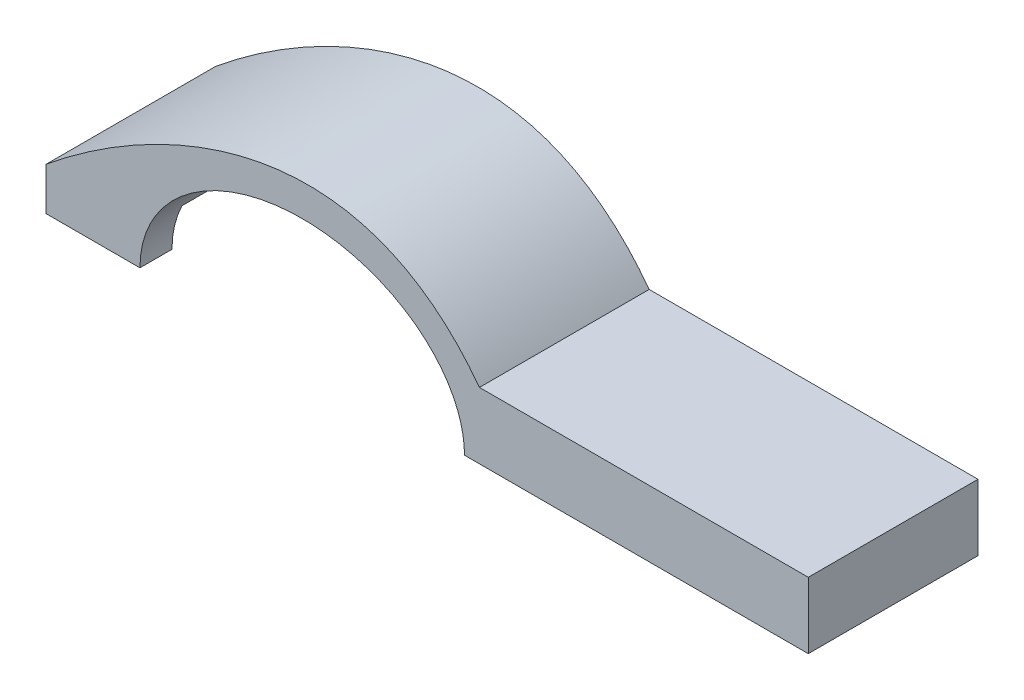
ISO-10303-21;
HEADER;
FILE_DESCRIPTION(('STEP AP214'),'2;1');
FILE_NAME('part.step','',(''),(''),'','','');
FILE_SCHEMA(('AUTOMOTIVE_DESIGN { 1 0 10303 214 1 1 1 1 }'));
ENDSEC;
DATA;
#1=APPLICATION_CONTEXT('core data for automotive mechanical design processes');
#2=APPLICATION_PROTOCOL_DEFINITION('international standard','automotive_design',2000,#1);
#3=PRODUCT_CONTEXT('',#1,'mechanical');
#4=PRODUCT('Part','Part','',(#3));
#5=PRODUCT_RELATED_PRODUCT_CATEGORY('part','',(#4));
#6=PRODUCT_DEFINITION_FORMATION('','',#4);
#7=PRODUCT_DEFINITION_CONTEXT('part definition',#1,'design');
#8=PRODUCT_DEFINITION('design','',#6,#7);
#9=PRODUCT_DEFINITION_SHAPE('','',#8);
#10=(LENGTH_UNIT() NAMED_UNIT(*) SI_UNIT(.MILLI.,.METRE.));
#11=(NAMED_UNIT(*) PLANE_ANGLE_UNIT() SI_UNIT($,.RADIAN.));
#12=(NAMED_UNIT(*) SI_UNIT($,.STERADIAN.) SOLID_ANGLE_UNIT());
#13=UNCERTAINTY_MEASURE_WITH_UNIT(LENGTH_MEASURE(1.E-05),#10,'distance_accuracy_value','');
#14=(GEOMETRIC_REPRESENTATION_CONTEXT(3) GLOBAL_UNCERTAINTY_ASSIGNED_CONTEXT((#13)) GLOBAL_UNIT_ASSIGNED_CONTEXT((#10,
#11,#12)) REPRESENTATION_CONTEXT('',''));
#15=CARTESIAN_POINT('',(0.,0.,0.));
#16=DIRECTION('',(0.,0.,1.));
#17=DIRECTION('',(1.,0.,0.));
#18=AXIS2_PLACEMENT_3D('',#15,#16,#17);
#19=CARTESIAN_POINT('',(15.3209477636629,-4.36351166737579,7.95));
#20=DIRECTION('',(1.,0.,0.));
#21=DIRECTION('',(0.,1.,0.));
#22=AXIS2_PLACEMENT_3D('',#19,#20,#21);
#23=PLANE('',#22);
#24=DIRECTION('',(0.,0.,-1.));
#25=VECTOR('',#24,1.);
#26=CARTESIAN_POINT('',(15.3209477636629,-4.36351166737579,7.95));
#27=LINE('',#26,#25);
#28=CARTESIAN_POINT('',(15.3209477636629,-4.36351166737579,1.5));
#29=VERTEX_POINT('',#28);
#30=CARTESIAN_POINT('',(15.3209477636629,-4.36351166737579,0.));
#31=VERTEX_POINT('',#30);
#32=EDGE_CURVE('E273',#29,#31,#27,.T.);
#33=ORIENTED_EDGE('',*,*,#32,.F.);
#34=DIRECTION('',(0.,-1.,0.));
#35=VECTOR('',#34,1.);
#36=CARTESIAN_POINT('',(15.3209477636629,-4.36351166737579,1.5));
#37=LINE('',#36,#35);
#38=CARTESIAN_POINT('',(15.3209477636629,-2.36351166737579,1.5));
#39=VERTEX_POINT('',#38);
#40=EDGE_CURVE('E182',#39,#29,#37,.T.);
#41=ORIENTED_EDGE('',*,*,#40,.F.);
#42=DIRECTION('',(0.,0.,-1.));
#43=VECTOR('',#42,1.);
#44=CARTESIAN_POINT('',(15.3209477636629,-2.36351166737579,7.95));
#45=LINE('',#44,#43);
#46=CARTESIAN_POINT('',(15.3209477636629,-2.36351166737579,0.));
#47=VERTEX_POINT('',#46);
#48=EDGE_CURVE('E249',#39,#47,#45,.T.);
#49=ORIENTED_EDGE('',*,*,#48,.T.);
#50=DIRECTION('',(0.,-1.,0.));
#51=VECTOR('',#50,1.);
#52=CARTESIAN_POINT('',(15.3209477636629,-4.36351166737579,0.));
#53=LINE('',#52,#51);
#54=EDGE_CURVE('E278',#47,#31,#53,.T.);
#55=ORIENTED_EDGE('',*,*,#54,.T.);
#56=EDGE_LOOP('',(#33,#41,#49,#55));
#57=FACE_BOUND('',#56,.T.);
#58=ADVANCED_FACE('F32',(#57),#23,.F.);
#59=CARTESIAN_POINT('',(19.7209477636629,-4.36351166737578,7.95));
#60=DIRECTION('',(0.,1.,0.));
#61=DIRECTION('',(-1.,0.,0.));
#62=AXIS2_PLACEMENT_3D('',#59,#60,#61);
#63=PLANE('',#62);
#64=DIRECTION('',(0.,0.,-1.));
#65=VECTOR('',#64,1.);
#66=CARTESIAN_POINT('',(19.7209477636629,-4.36351166737579,7.95));
#67=LINE('',#66,#65);
#68=CARTESIAN_POINT('',(19.7209477636629,-4.36351166737578,1.5));
#69=VERTEX_POINT('',#68);
#70=CARTESIAN_POINT('',(19.7209477636629,-4.36351166737579,0.));
#71=VERTEX_POINT('',#70);
#72=EDGE_CURVE('E275',#69,#71,#67,.T.);
#73=ORIENTED_EDGE('',*,*,#72,.F.);
#74=DIRECTION('',(-1.,0.,0.));
#75=VECTOR('',#74,1.);
#76=CARTESIAN_POINT('',(23.1209477636629,-4.36351166737578,1.5));
#77=LINE('',#76,#75);
#78=EDGE_CURVE('E185',#69,#29,#77,.T.);
#79=ORIENTED_EDGE('',*,*,#78,.T.);
#80=ORIENTED_EDGE('',*,*,#32,.T.);
#81=DIRECTION('',(1.,0.,0.));
#82=VECTOR('',#81,1.);
#83=CARTESIAN_POINT('',(19.7209477636629,-4.36351166737578,0.));
#84=LINE('',#83,#82);
#85=EDGE_CURVE('E294',#31,#71,#84,.T.);
#86=ORIENTED_EDGE('',*,*,#85,.T.);
#87=EDGE_LOOP('',(#73,#79,#80,#86));
#88=FACE_BOUND('',#87,.T.);
#89=ADVANCED_FACE('F222',(#88),#63,.F.);
#90=CARTESIAN_POINT('',(51.0209477636629,-4.36351166737578,7.95));
#91=DIRECTION('',(-1.,0.,0.));
#92=DIRECTION('',(0.,0.,1.));
#93=AXIS2_PLACEMENT_3D('',#90,#91,#92);
#94=PLANE('',#93);
#95=DIRECTION('',(0.,1.,0.));
#96=VECTOR('',#95,1.);
#97=CARTESIAN_POINT('',(51.0209477636629,-4.36351166737578,0.));
#98=LINE('',#97,#96);
#99=CARTESIAN_POINT('',(51.0209477636629,-4.36351166737578,0.));
#100=VERTEX_POINT('',#99);
#101=CARTESIAN_POINT('',(51.0209477636629,-1.26351166737578,0.));
#102=VERTEX_POINT('',#101);
#103=EDGE_CURVE('E188',#100,#102,#98,.T.);
#104=ORIENTED_EDGE('',*,*,#103,.T.);
#105=DIRECTION('',(0.,0.,-1.));
#106=VECTOR('',#105,1.);
#107=CARTESIAN_POINT('',(51.0209477636629,-1.26351166737578,7.95));
#108=LINE('',#107,#106);
#109=CARTESIAN_POINT('',(51.0209477636629,-1.26351166737578,7.95));
#110=VERTEX_POINT('',#109);
#111=EDGE_CURVE('E252',#110,#102,#108,.T.);
#112=ORIENTED_EDGE('',*,*,#111,.F.);
#113=DIRECTION('',(0.,1.,0.));
#114=VECTOR('',#113,1.);
#115=CARTESIAN_POINT('',(51.0209477636629,-4.36351166737578,7.95));
#116=LINE('',#115,#114);
#117=CARTESIAN_POINT('',(51.0209477636629,-4.36351166737578,7.95));
#118=VERTEX_POINT('',#117);
#119=EDGE_CURVE('E193',#118,#110,#116,.T.);
#120=ORIENTED_EDGE('',*,*,#119,.F.);
#121=DIRECTION('',(0.,0.,-1.));
#122=VECTOR('',#121,1.);
#123=CARTESIAN_POINT('',(51.0209477636629,-4.36351166737578,7.95));
#124=LINE('',#123,#122);
#125=EDGE_CURVE('E287',#118,#100,#124,.T.);
#126=ORIENTED_EDGE('',*,*,#125,.T.);
#127=EDGE_LOOP('',(#104,#112,#120,#126));
#128=FACE_BOUND('',#127,.T.);
#129=ADVANCED_FACE('F34',(#128),#94,.F.);
#130=CARTESIAN_POINT('',(51.0209477636629,-1.26351166737578,7.95));
#131=DIRECTION('',(0.,-1.,0.));
#132=DIRECTION('',(1.,0.,0.));
#133=AXIS2_PLACEMENT_3D('',#130,#131,#132);
#134=PLANE('',#133);
#135=DIRECTION('',(-1.,0.,0.));
#136=VECTOR('',#135,1.);
#137=CARTESIAN_POINT('',(51.0209477636629,-1.26351166737578,0.));
#138=LINE('',#137,#136);
#139=CARTESIAN_POINT('',(35.6209477636629,-1.26351166737578,0.));
#140=VERTEX_POINT('',#139);
#141=EDGE_CURVE('E302',#102,#140,#138,.T.);
#142=ORIENTED_EDGE('',*,*,#141,.T.);
#143=DIRECTION('',(0.,0.,-1.));
#144=VECTOR('',#143,1.);
#145=CARTESIAN_POINT('',(35.6209477636629,-1.26351166737578,7.95));
#146=LINE('',#145,#144);
#147=CARTESIAN_POINT('',(35.6209477636629,-1.26351166737578,7.95));
#148=VERTEX_POINT('',#147);
#149=EDGE_CURVE('E248',#148,#140,#146,.T.);
#150=ORIENTED_EDGE('',*,*,#149,.F.);
#151=DIRECTION('',(-1.,0.,0.));
#152=VECTOR('',#151,1.);
#153=CARTESIAN_POINT('',(51.0209477636629,-1.26351166737578,7.95));
#154=LINE('',#153,#152);
#155=EDGE_CURVE('E196',#110,#148,#154,.T.);
#156=ORIENTED_EDGE('',*,*,#155,.F.);
#157=ORIENTED_EDGE('',*,*,#111,.T.);
#158=EDGE_LOOP('',(#142,#150,#156,#157));
#159=FACE_BOUND('',#158,.T.);
#160=ADVANCED_FACE('F214',(#159),#134,.F.);
#161=CARTESIAN_POINT('',(35.6209477636629,-1.26351166737578,7.95));
#162=CARTESIAN_POINT('',(29.9274098348846,6.3697250617846,7.95));
#163=CARTESIAN_POINT('',(20.772849701629,2.12408853296766,7.95));
#164=CARTESIAN_POINT('',(15.3209477636629,-2.36351166737579,7.95));
#165=B_SPLINE_CURVE_WITH_KNOTS('',3,(#161,#162,#163,#164),.UNSPECIFIED.,.F.,.F.,(4,4),(0.,1.),.UNSPECIFIED.);
#166=DIRECTION('',(0.,0.,-1.));
#167=VECTOR('',#166,1.);
#168=SURFACE_OF_LINEAR_EXTRUSION('',#165,#167);
#169=CARTESIAN_POINT('',(35.6209477636629,-1.26351166737578,0.));
#170=CARTESIAN_POINT('',(29.9274098348846,6.3697250617846,0.));
#171=CARTESIAN_POINT('',(20.772849701629,2.12408853296766,0.));
#172=CARTESIAN_POINT('',(15.3209477636629,-2.36351166737579,0.));
#173=B_SPLINE_CURVE_WITH_KNOTS('',3,(#169,#170,#171,#172),.UNSPECIFIED.,.F.,.F.,(4,4),(0.,1.),.UNSPECIFIED.);
#174=EDGE_CURVE('E297',#140,#47,#173,.T.);
#175=ORIENTED_EDGE('',*,*,#174,.T.);
#176=ORIENTED_EDGE('',*,*,#48,.F.);
#177=DIRECTION('',(0.,0.,-1.));
#178=VECTOR('',#177,1.);
#179=CARTESIAN_POINT('',(15.3209477636629,-2.36351166737579,1.5));
#180=LINE('',#179,#178);
#181=CARTESIAN_POINT('',(15.3209477636629,-2.36351166737579,6.45));
#182=VERTEX_POINT('',#181);
#183=EDGE_CURVE('E179',#182,#39,#180,.T.);
#184=ORIENTED_EDGE('',*,*,#183,.F.);
#185=CARTESIAN_POINT('',(15.3209477636629,-2.36351166737579,7.95));
#186=VERTEX_POINT('',#185);
#187=EDGE_CURVE('E243',#186,#182,#45,.T.);
#188=ORIENTED_EDGE('',*,*,#187,.F.);
#189=EDGE_CURVE('E199',#148,#186,#165,.T.);
#190=ORIENTED_EDGE('',*,*,#189,.F.);
#191=ORIENTED_EDGE('',*,*,#149,.T.);
#192=EDGE_LOOP('',(#175,#176,#184,#188,#190,#191));
#193=FACE_BOUND('',#192,.T.);
#194=ADVANCED_FACE('F210',(#193),#168,.F.);
#195=ORIENTED_EDGE('',*,*,#187,.T.);
#196=DIRECTION('',(0.,1.,0.));
#197=VECTOR('',#196,1.);
#198=CARTESIAN_POINT('',(15.3209477636629,-2.36351166737579,6.45));
#199=LINE('',#198,#197);
#200=CARTESIAN_POINT('',(15.3209477636629,-4.36351166737579,6.45));
#201=VERTEX_POINT('',#200);
#202=EDGE_CURVE('E174',#201,#182,#199,.T.);
#203=ORIENTED_EDGE('',*,*,#202,.F.);
#204=CARTESIAN_POINT('',(15.3209477636629,-4.36351166737579,7.95));
#205=VERTEX_POINT('',#204);
#206=EDGE_CURVE('E254',#205,#201,#27,.T.);
#207=ORIENTED_EDGE('',*,*,#206,.F.);
#208=DIRECTION('',(0.,-1.,0.));
#209=VECTOR('',#208,1.);
#210=CARTESIAN_POINT('',(15.3209477636629,-4.36351166737579,7.95));
#211=LINE('',#210,#209);
#212=EDGE_CURVE('E204',#186,#205,#211,.T.);
#213=ORIENTED_EDGE('',*,*,#212,.F.);
#214=EDGE_LOOP('',(#195,#203,#207,#213));
#215=FACE_BOUND('',#214,.T.);
#216=ADVANCED_FACE('F213',(#215),#23,.F.);
#217=ORIENTED_EDGE('',*,*,#206,.T.);
#218=DIRECTION('',(-1.,0.,0.));
#219=VECTOR('',#218,1.);
#220=CARTESIAN_POINT('',(23.1209477636629,-4.36351166737578,6.45));
#221=LINE('',#220,#219);
#222=CARTESIAN_POINT('',(19.7209477636629,-4.36351166737578,6.45));
#223=VERTEX_POINT('',#222);
#224=EDGE_CURVE('E184',#223,#201,#221,.T.);
#225=ORIENTED_EDGE('',*,*,#224,.F.);
#226=CARTESIAN_POINT('',(19.7209477636629,-4.36351166737579,7.95));
#227=VERTEX_POINT('',#226);
#228=EDGE_CURVE('E280',#227,#223,#67,.T.);
#229=ORIENTED_EDGE('',*,*,#228,.F.);
#230=DIRECTION('',(1.,0.,0.));
#231=VECTOR('',#230,1.);
#232=CARTESIAN_POINT('',(19.7209477636629,-4.36351166737578,7.95));
#233=LINE('',#232,#231);
#234=EDGE_CURVE('E312',#205,#227,#233,.T.);
#235=ORIENTED_EDGE('',*,*,#234,.F.);
#236=EDGE_LOOP('',(#217,#225,#229,#235));
#237=FACE_BOUND('',#236,.T.);
#238=ADVANCED_FACE('F230',(#237),#63,.F.);
#239=CARTESIAN_POINT('',(27.3209477636629,-4.36351166737578,7.95));
#240=DIRECTION('',(0.,0.,-1.));
#241=DIRECTION('',(1.,0.,0.));
#242=AXIS2_PLACEMENT_3D('',#239,#240,#241);
#243=ELLIPSE('',#242,7.6,5.8);
#244=DIRECTION('',(0.,0.,-1.));
#245=VECTOR('',#244,1.);
#246=SURFACE_OF_LINEAR_EXTRUSION('',#243,#245);
#247=DIRECTION('',(0.,0.,-1.));
#248=VECTOR('',#247,1.);
#249=CARTESIAN_POINT('',(20.187085855042,-2.36351166737578,7.95));
#250=LINE('',#249,#248);
#251=CARTESIAN_POINT('',(20.187085855042,-2.36351166737578,6.45));
#252=VERTEX_POINT('',#251);
#253=CARTESIAN_POINT('',(20.187085855042,-2.36351166737578,1.5));
#254=VERTEX_POINT('',#253);
#255=EDGE_CURVE('E40',#252,#254,#250,.T.);
#256=ORIENTED_EDGE('',*,*,#255,.T.);
#257=CARTESIAN_POINT('',(27.3209477636629,-4.36351166737578,1.5));
#258=DIRECTION('',(0.,0.,-1.));
#259=DIRECTION('',(1.,0.,0.));
#260=AXIS2_PLACEMENT_3D('',#257,#258,#259);
#261=ELLIPSE('',#260,7.6,5.8);
#262=EDGE_CURVE('E11',#254,#69,#261,.F.);
#263=ORIENTED_EDGE('',*,*,#262,.T.);
#264=ORIENTED_EDGE('',*,*,#72,.T.);
#265=CARTESIAN_POINT('',(27.3209477636629,-4.36351166737578,0.));
#266=DIRECTION('',(0.,0.,-1.));
#267=DIRECTION('',(1.,0.,0.));
#268=AXIS2_PLACEMENT_3D('',#265,#266,#267);
#269=ELLIPSE('',#268,7.6,5.8);
#270=CARTESIAN_POINT('',(34.9209477636629,-4.36351166737578,0.));
#271=VERTEX_POINT('',#270);
#272=EDGE_CURVE('E292',#71,#271,#269,.T.);
#273=ORIENTED_EDGE('',*,*,#272,.T.);
#274=DIRECTION('',(0.,0.,-1.));
#275=VECTOR('',#274,1.);
#276=CARTESIAN_POINT('',(34.9209477636629,-4.36351166737578,7.95));
#277=LINE('',#276,#275);
#278=CARTESIAN_POINT('',(34.9209477636629,-4.36351166737578,7.95));
#279=VERTEX_POINT('',#278);
#280=EDGE_CURVE('E283',#279,#271,#277,.T.);
#281=ORIENTED_EDGE('',*,*,#280,.F.);
#282=EDGE_CURVE('E310',#227,#279,#243,.T.);
#283=ORIENTED_EDGE('',*,*,#282,.F.);
#284=ORIENTED_EDGE('',*,*,#228,.T.);
#285=CARTESIAN_POINT('',(27.3209477636629,-4.36351166737578,6.45));
#286=DIRECTION('',(0.,0.,-1.));
#287=DIRECTION('',(1.,0.,0.));
#288=AXIS2_PLACEMENT_3D('',#285,#286,#287);
#289=ELLIPSE('',#288,7.6,5.8);
#290=EDGE_CURVE('E260',#223,#252,#289,.T.);
#291=ORIENTED_EDGE('',*,*,#290,.T.);
#292=EDGE_LOOP('',(#256,#263,#264,#273,#281,#283,#284,#291));
#293=FACE_BOUND('',#292,.T.);
#294=ADVANCED_FACE('F237',(#293),#246,.F.);
#295=CARTESIAN_POINT('',(51.0209477636629,-4.36351166737578,7.95));
#296=DIRECTION('',(0.,1.,0.));
#297=DIRECTION('',(-1.,0.,0.));
#298=AXIS2_PLACEMENT_3D('',#295,#296,#297);
#299=PLANE('',#298);
#300=DIRECTION('',(0.,0.,-1.));
#301=VECTOR('',#300,1.);
#302=CARTESIAN_POINT('',(36.4209477636629,-4.36351166737578,6.45));
#303=LINE('',#302,#301);
#304=CARTESIAN_POINT('',(36.4209477636629,-4.36351166737578,6.45));
#305=VERTEX_POINT('',#304);
#306=CARTESIAN_POINT('',(36.4209477636629,-4.36351166737578,1.5));
#307=VERTEX_POINT('',#306);
#308=EDGE_CURVE('E168',#305,#307,#303,.T.);
#309=ORIENTED_EDGE('',*,*,#308,.F.);
#310=DIRECTION('',(-1.,0.,0.));
#311=VECTOR('',#310,1.);
#312=CARTESIAN_POINT('',(36.4209477636629,-4.36351166737578,6.45));
#313=LINE('',#312,#311);
#314=CARTESIAN_POINT('',(49.5209477636629,-4.36351166737578,6.45));
#315=VERTEX_POINT('',#314);
#316=EDGE_CURVE('E47',#315,#305,#313,.T.);
#317=ORIENTED_EDGE('',*,*,#316,.F.);
#318=DIRECTION('',(0.,0.,1.));
#319=VECTOR('',#318,1.);
#320=CARTESIAN_POINT('',(49.5209477636629,-4.36351166737578,1.5));
#321=LINE('',#320,#319);
#322=CARTESIAN_POINT('',(49.5209477636629,-4.36351166737578,1.5));
#323=VERTEX_POINT('',#322);
#324=EDGE_CURVE('E159',#323,#315,#321,.T.);
#325=ORIENTED_EDGE('',*,*,#324,.F.);
#326=DIRECTION('',(1.,0.,0.));
#327=VECTOR('',#326,1.);
#328=CARTESIAN_POINT('',(36.4209477636629,-4.36351166737578,1.5));
#329=LINE('',#328,#327);
#330=EDGE_CURVE('E162',#307,#323,#329,.T.);
#331=ORIENTED_EDGE('',*,*,#330,.F.);
#332=EDGE_LOOP('',(#309,#317,#325,#331));
#333=FACE_BOUND('',#332,.T.);
#334=DIRECTION('',(1.,0.,0.));
#335=VECTOR('',#334,1.);
#336=CARTESIAN_POINT('',(51.0209477636629,-4.36351166737578,0.));
#337=LINE('',#336,#335);
#338=EDGE_CURVE('E197',#271,#100,#337,.T.);
#339=ORIENTED_EDGE('',*,*,#338,.T.);
#340=ORIENTED_EDGE('',*,*,#125,.F.);
#341=DIRECTION('',(1.,0.,0.));
#342=VECTOR('',#341,1.);
#343=CARTESIAN_POINT('',(51.0209477636629,-4.36351166737578,7.95));
#344=LINE('',#343,#342);
#345=EDGE_CURVE('E290',#279,#118,#344,.T.);
#346=ORIENTED_EDGE('',*,*,#345,.F.);
#347=ORIENTED_EDGE('',*,*,#280,.T.);
#348=EDGE_LOOP('',(#339,#340,#346,#347));
#349=FACE_BOUND('',#348,.T.);
#350=ADVANCED_FACE('F316',(#333,#349),#299,.F.);
#351=CARTESIAN_POINT('',(25.3803342671083,2.73180218118815,7.95));
#352=DIRECTION('',(0.,0.,1.));
#353=DIRECTION('',(1.,0.,0.));
#354=AXIS2_PLACEMENT_3D('',#351,#352,#353);
#355=PLANE('',#354);
#356=ORIENTED_EDGE('',*,*,#119,.T.);
#357=ORIENTED_EDGE('',*,*,#155,.T.);
#358=ORIENTED_EDGE('',*,*,#189,.T.);
#359=ORIENTED_EDGE('',*,*,#212,.T.);
#360=ORIENTED_EDGE('',*,*,#234,.T.);
#361=ORIENTED_EDGE('',*,*,#282,.T.);
#362=ORIENTED_EDGE('',*,*,#345,.T.);
#363=EDGE_LOOP('',(#356,#357,#358,#359,#360,#361,#362));
#364=FACE_BOUND('',#363,.T.);
#365=ADVANCED_FACE('F319',(#364),#355,.T.);
#366=CARTESIAN_POINT('',(25.3803342671083,2.73180218118815,0.));
#367=DIRECTION('',(0.,0.,1.));
#368=DIRECTION('',(1.,0.,0.));
#369=AXIS2_PLACEMENT_3D('',#366,#367,#368);
#370=PLANE('',#369);
#371=ORIENTED_EDGE('',*,*,#103,.F.);
#372=ORIENTED_EDGE('',*,*,#338,.F.);
#373=ORIENTED_EDGE('',*,*,#272,.F.);
#374=ORIENTED_EDGE('',*,*,#85,.F.);
#375=ORIENTED_EDGE('',*,*,#54,.F.);
#376=ORIENTED_EDGE('',*,*,#174,.F.);
#377=ORIENTED_EDGE('',*,*,#141,.F.);
#378=EDGE_LOOP('',(#371,#372,#373,#374,#375,#376,#377));
#379=FACE_BOUND('',#378,.T.);
#380=ADVANCED_FACE('F321',(#379),#370,.F.);
#381=CARTESIAN_POINT('',(23.1209477636629,-4.36351166737578,1.5));
#382=DIRECTION('',(0.,0.,-1.));
#383=DIRECTION('',(0.,1.,0.));
#384=AXIS2_PLACEMENT_3D('',#381,#382,#383);
#385=PLANE('',#384);
#386=DIRECTION('',(-1.,0.,0.));
#387=VECTOR('',#386,1.);
#388=CARTESIAN_POINT('',(23.1209477636629,-2.36351166737578,1.5));
#389=LINE('',#388,#387);
#390=EDGE_CURVE('E189',#254,#39,#389,.T.);
#391=ORIENTED_EDGE('',*,*,#390,.T.);
#392=ORIENTED_EDGE('',*,*,#40,.T.);
#393=ORIENTED_EDGE('',*,*,#78,.F.);
#394=ORIENTED_EDGE('',*,*,#262,.F.);
#395=EDGE_LOOP('',(#391,#392,#393,#394));
#396=FACE_BOUND('',#395,.T.);
#397=ADVANCED_FACE('F271',(#396),#385,.F.);
#398=CARTESIAN_POINT('',(23.1209477636629,-2.36351166737578,1.5));
#399=DIRECTION('',(0.,1.,0.));
#400=DIRECTION('',(-1.,0.,0.));
#401=AXIS2_PLACEMENT_3D('',#398,#399,#400);
#402=PLANE('',#401);
#403=DIRECTION('',(-1.,0.,0.));
#404=VECTOR('',#403,1.);
#405=CARTESIAN_POINT('',(23.1209477636629,-2.36351166737578,6.45));
#406=LINE('',#405,#404);
#407=EDGE_CURVE('E55',#252,#182,#406,.T.);
#408=ORIENTED_EDGE('',*,*,#407,.T.);
#409=ORIENTED_EDGE('',*,*,#183,.T.);
#410=ORIENTED_EDGE('',*,*,#390,.F.);
#411=ORIENTED_EDGE('',*,*,#255,.F.);
#412=EDGE_LOOP('',(#408,#409,#410,#411));
#413=FACE_BOUND('',#412,.T.);
#414=ADVANCED_FACE('F268',(#413),#402,.F.);
#415=CARTESIAN_POINT('',(23.1209477636629,-2.36351166737578,6.45));
#416=DIRECTION('',(0.,0.,1.));
#417=DIRECTION('',(1.,0.,0.));
#418=AXIS2_PLACEMENT_3D('',#415,#416,#417);
#419=PLANE('',#418);
#420=ORIENTED_EDGE('',*,*,#224,.T.);
#421=ORIENTED_EDGE('',*,*,#202,.T.);
#422=ORIENTED_EDGE('',*,*,#407,.F.);
#423=ORIENTED_EDGE('',*,*,#290,.F.);
#424=EDGE_LOOP('',(#420,#421,#422,#423));
#425=FACE_BOUND('',#424,.T.);
#426=ADVANCED_FACE('F328',(#425),#419,.F.);
#427=CARTESIAN_POINT('',(36.4209477636629,-2.36351166737578,6.45));
#428=DIRECTION('',(0.,0.,1.));
#429=DIRECTION('',(1.,0.,0.));
#430=AXIS2_PLACEMENT_3D('',#427,#428,#429);
#431=PLANE('',#430);
#432=ORIENTED_EDGE('',*,*,#316,.T.);
#433=DIRECTION('',(0.,-1.,0.));
#434=VECTOR('',#433,1.);
#435=CARTESIAN_POINT('',(36.4209477636629,-2.36351166737578,6.45));
#436=LINE('',#435,#434);
#437=CARTESIAN_POINT('',(36.4209477636629,-2.36351166737578,6.45));
#438=VERTEX_POINT('',#437);
#439=EDGE_CURVE('E137',#438,#305,#436,.T.);
#440=ORIENTED_EDGE('',*,*,#439,.F.);
#441=DIRECTION('',(-1.,0.,0.));
#442=VECTOR('',#441,1.);
#443=CARTESIAN_POINT('',(36.4209477636629,-2.36351166737578,6.45));
#444=LINE('',#443,#442);
#445=CARTESIAN_POINT('',(49.5209477636629,-2.36351166737578,6.45));
#446=VERTEX_POINT('',#445);
#447=EDGE_CURVE('E141',#446,#438,#444,.T.);
#448=ORIENTED_EDGE('',*,*,#447,.F.);
#449=DIRECTION('',(0.,-1.,0.));
#450=VECTOR('',#449,1.);
#451=CARTESIAN_POINT('',(49.5209477636629,-2.36351166737578,6.45));
#452=LINE('',#451,#450);
#453=EDGE_CURVE('E172',#446,#315,#452,.T.);
#454=ORIENTED_EDGE('',*,*,#453,.T.);
#455=EDGE_LOOP('',(#432,#440,#448,#454));
#456=FACE_BOUND('',#455,.T.);
#457=ADVANCED_FACE('F139',(#456),#431,.F.);
#458=CARTESIAN_POINT('',(49.5209477636629,-2.36351166737578,1.5));
#459=DIRECTION('',(1.,0.,0.));
#460=DIRECTION('',(0.,1.,0.));
#461=AXIS2_PLACEMENT_3D('',#458,#459,#460);
#462=PLANE('',#461);
#463=ORIENTED_EDGE('',*,*,#324,.T.);
#464=ORIENTED_EDGE('',*,*,#453,.F.);
#465=DIRECTION('',(0.,0.,1.));
#466=VECTOR('',#465,1.);
#467=CARTESIAN_POINT('',(49.5209477636629,-2.36351166737578,1.5));
#468=LINE('',#467,#466);
#469=CARTESIAN_POINT('',(49.5209477636629,-2.36351166737578,1.5));
#470=VERTEX_POINT('',#469);
#471=EDGE_CURVE('E147',#470,#446,#468,.T.);
#472=ORIENTED_EDGE('',*,*,#471,.F.);
#473=DIRECTION('',(0.,-1.,0.));
#474=VECTOR('',#473,1.);
#475=CARTESIAN_POINT('',(49.5209477636629,-2.36351166737578,1.5));
#476=LINE('',#475,#474);
#477=EDGE_CURVE('E175',#470,#323,#476,.T.);
#478=ORIENTED_EDGE('',*,*,#477,.T.);
#479=EDGE_LOOP('',(#463,#464,#472,#478));
#480=FACE_BOUND('',#479,.T.);
#481=ADVANCED_FACE('F337',(#480),#462,.F.);
#482=CARTESIAN_POINT('',(36.4209477636629,-2.36351166737578,1.5));
#483=DIRECTION('',(0.,0.,-1.));
#484=DIRECTION('',(-1.,0.,0.));
#485=AXIS2_PLACEMENT_3D('',#482,#483,#484);
#486=PLANE('',#485);
#487=ORIENTED_EDGE('',*,*,#330,.T.);
#488=ORIENTED_EDGE('',*,*,#477,.F.);
#489=DIRECTION('',(1.,0.,0.));
#490=VECTOR('',#489,1.);
#491=CARTESIAN_POINT('',(36.4209477636629,-2.36351166737578,1.5));
#492=LINE('',#491,#490);
#493=CARTESIAN_POINT('',(36.4209477636629,-2.36351166737578,1.5));
#494=VERTEX_POINT('',#493);
#495=EDGE_CURVE('E155',#494,#470,#492,.T.);
#496=ORIENTED_EDGE('',*,*,#495,.F.);
#497=DIRECTION('',(0.,-1.,0.));
#498=VECTOR('',#497,1.);
#499=CARTESIAN_POINT('',(36.4209477636629,-2.36351166737578,1.5));
#500=LINE('',#499,#498);
#501=EDGE_CURVE('E146',#494,#307,#500,.T.);
#502=ORIENTED_EDGE('',*,*,#501,.T.);
#503=EDGE_LOOP('',(#487,#488,#496,#502));
#504=FACE_BOUND('',#503,.T.);
#505=ADVANCED_FACE('F340',(#504),#486,.F.);
#506=CARTESIAN_POINT('',(36.4209477636629,-2.36351166737578,6.45));
#507=DIRECTION('',(-1.,0.,0.));
#508=DIRECTION('',(0.,-1.,0.));
#509=AXIS2_PLACEMENT_3D('',#506,#507,#508);
#510=PLANE('',#509);
#511=ORIENTED_EDGE('',*,*,#308,.T.);
#512=ORIENTED_EDGE('',*,*,#501,.F.);
#513=DIRECTION('',(0.,0.,-1.));
#514=VECTOR('',#513,1.);
#515=CARTESIAN_POINT('',(36.4209477636629,-2.36351166737578,6.45));
#516=LINE('',#515,#514);
#517=EDGE_CURVE('E150',#438,#494,#516,.T.);
#518=ORIENTED_EDGE('',*,*,#517,.F.);
#519=ORIENTED_EDGE('',*,*,#439,.T.);
#520=EDGE_LOOP('',(#511,#512,#518,#519));
#521=FACE_BOUND('',#520,.T.);
#522=ADVANCED_FACE('F151',(#521),#510,.F.);
#523=CARTESIAN_POINT('',(49.5209477636629,-2.36351166737578,6.45));
#524=DIRECTION('',(0.,-1.,0.));
#525=DIRECTION('',(1.,0.,0.));
#526=AXIS2_PLACEMENT_3D('',#523,#524,#525);
#527=PLANE('',#526);
#528=ORIENTED_EDGE('',*,*,#447,.T.);
#529=ORIENTED_EDGE('',*,*,#517,.T.);
#530=ORIENTED_EDGE('',*,*,#495,.T.);
#531=ORIENTED_EDGE('',*,*,#471,.T.);
#532=EDGE_LOOP('',(#528,#529,#530,#531));
#533=FACE_BOUND('',#532,.T.);
#534=ADVANCED_FACE('F157',(#533),#527,.T.);
#535=CLOSED_SHELL('',(#58,#89,#129,#160,#194,#216,#238,#294,#350,#365,#380,#397,#414,#426,#457,
#481,#505,#522,#534));
#536=MANIFOLD_SOLID_BREP('B2',#535);
#537=ADVANCED_BREP_SHAPE_REPRESENTATION('',(#18,#536),#14);
#538=SHAPE_DEFINITION_REPRESENTATION(#9,#537);
ENDSEC;
END-ISO-10303-21;
